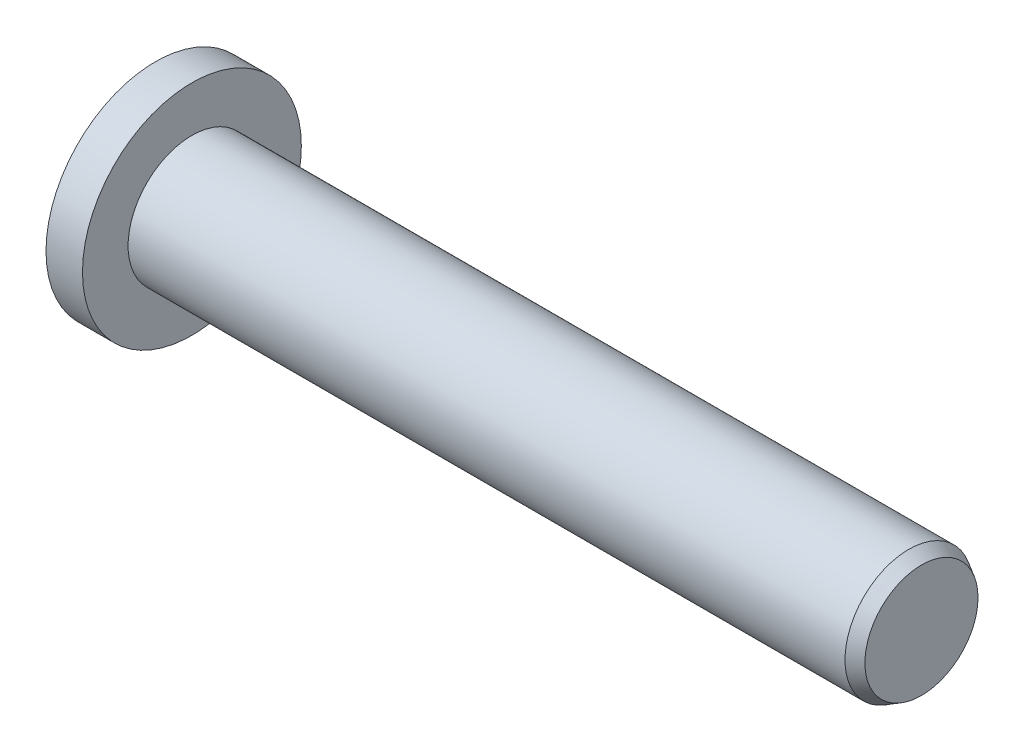
ISO-10303-21;
HEADER;
FILE_DESCRIPTION(('STEP AP214'),'2;1');
FILE_NAME('part.step','',(''),(''),'','','');
FILE_SCHEMA(('AUTOMOTIVE_DESIGN { 1 0 10303 214 1 1 1 1 }'));
ENDSEC;
DATA;
#1=APPLICATION_CONTEXT('core data for automotive mechanical design processes');
#2=APPLICATION_PROTOCOL_DEFINITION('international standard','automotive_design',2000,#1);
#3=PRODUCT_CONTEXT('',#1,'mechanical');
#4=PRODUCT('Part','Part','',(#3));
#5=PRODUCT_RELATED_PRODUCT_CATEGORY('part','',(#4));
#6=PRODUCT_DEFINITION_FORMATION('','',#4);
#7=PRODUCT_DEFINITION_CONTEXT('part definition',#1,'design');
#8=PRODUCT_DEFINITION('design','',#6,#7);
#9=PRODUCT_DEFINITION_SHAPE('','',#8);
#10=(LENGTH_UNIT() NAMED_UNIT(*) SI_UNIT(.MILLI.,.METRE.));
#11=(NAMED_UNIT(*) PLANE_ANGLE_UNIT() SI_UNIT($,.RADIAN.));
#12=(NAMED_UNIT(*) SI_UNIT($,.STERADIAN.) SOLID_ANGLE_UNIT());
#13=UNCERTAINTY_MEASURE_WITH_UNIT(LENGTH_MEASURE(1.E-05),#10,'distance_accuracy_value','');
#14=(GEOMETRIC_REPRESENTATION_CONTEXT(3) GLOBAL_UNCERTAINTY_ASSIGNED_CONTEXT((#13)) GLOBAL_UNIT_ASSIGNED_CONTEXT((#10,
#11,#12)) REPRESENTATION_CONTEXT('',''));
#15=CARTESIAN_POINT('',(0.,0.,0.));
#16=DIRECTION('',(0.,0.,1.));
#17=DIRECTION('',(1.,0.,0.));
#18=AXIS2_PLACEMENT_3D('',#15,#16,#17);
#19=CARTESIAN_POINT('',(0.,0.,0.));
#20=DIRECTION('',(-1.,0.,0.));
#21=DIRECTION('',(0.,0.,1.));
#22=AXIS2_PLACEMENT_3D('',#19,#20,#21);
#23=PLANE('',#22);
#24=CARTESIAN_POINT('',(0.,0.,0.));
#25=DIRECTION('',(1.,0.,0.));
#26=DIRECTION('',(0.,0.,-1.));
#27=AXIS2_PLACEMENT_3D('',#24,#25,#26);
#28=CIRCLE('',#27,3.);
#29=CARTESIAN_POINT('',(0.,0.,-3.));
#30=VERTEX_POINT('',#29);
#31=EDGE_CURVE('E10',#30,#30,#28,.T.);
#32=ORIENTED_EDGE('',*,*,#31,.F.);
#33=EDGE_LOOP('',(#32));
#34=FACE_BOUND('',#33,.T.);
#35=ADVANCED_FACE('F33',(#34),#23,.T.);
#36=CARTESIAN_POINT('',(0.,0.,0.));
#37=DIRECTION('',(1.,0.,0.));
#38=DIRECTION('',(0.,0.,-1.));
#39=AXIS2_PLACEMENT_3D('',#36,#37,#38);
#40=CYLINDRICAL_SURFACE('',#39,3.);
#41=ORIENTED_EDGE('',*,*,#31,.T.);
#42=EDGE_LOOP('',(#41));
#43=FACE_BOUND('',#42,.T.);
#44=CARTESIAN_POINT('',(1.,0.,0.));
#45=DIRECTION('',(1.,0.,0.));
#46=DIRECTION('',(0.,0.,-1.));
#47=AXIS2_PLACEMENT_3D('',#44,#45,#46);
#48=CIRCLE('',#47,3.);
#49=CARTESIAN_POINT('',(1.,0.,-3.));
#50=VERTEX_POINT('',#49);
#51=EDGE_CURVE('E39',#50,#50,#48,.T.);
#52=ORIENTED_EDGE('',*,*,#51,.F.);
#53=EDGE_LOOP('',(#52));
#54=FACE_BOUND('',#53,.T.);
#55=ADVANCED_FACE('F72',(#43,#54),#40,.T.);
#56=CARTESIAN_POINT('',(1.,3.,0.));
#57=DIRECTION('',(1.,0.,0.));
#58=DIRECTION('',(0.,0.,-1.));
#59=AXIS2_PLACEMENT_3D('',#56,#57,#58);
#60=PLANE('',#59);
#61=ORIENTED_EDGE('',*,*,#51,.T.);
#62=EDGE_LOOP('',(#61));
#63=FACE_BOUND('',#62,.T.);
#64=CARTESIAN_POINT('',(1.,0.,0.));
#65=DIRECTION('',(1.,0.,0.));
#66=DIRECTION('',(0.,0.,-1.));
#67=AXIS2_PLACEMENT_3D('',#64,#65,#66);
#68=CIRCLE('',#67,1.75);
#69=CARTESIAN_POINT('',(1.,0.,-1.75));
#70=VERTEX_POINT('',#69);
#71=EDGE_CURVE('E43',#70,#70,#68,.T.);
#72=ORIENTED_EDGE('',*,*,#71,.F.);
#73=EDGE_LOOP('',(#72));
#74=FACE_BOUND('',#73,.T.);
#75=ADVANCED_FACE('F68',(#63,#74),#60,.T.);
#76=CARTESIAN_POINT('',(0.,0.,0.));
#77=DIRECTION('',(1.,0.,0.));
#78=DIRECTION('',(0.,0.,-1.));
#79=AXIS2_PLACEMENT_3D('',#76,#77,#78);
#80=CYLINDRICAL_SURFACE('',#79,1.75);
#81=ORIENTED_EDGE('',*,*,#71,.T.);
#82=EDGE_LOOP('',(#81));
#83=FACE_BOUND('',#82,.T.);
#84=CARTESIAN_POINT('',(20.6535898384862,0.,0.));
#85=DIRECTION('',(1.,0.,0.));
#86=DIRECTION('',(0.,0.,-1.));
#87=AXIS2_PLACEMENT_3D('',#84,#85,#86);
#88=CIRCLE('',#87,1.75);
#89=CARTESIAN_POINT('',(20.6535898384862,0.,-1.75));
#90=VERTEX_POINT('',#89);
#91=EDGE_CURVE('E47',#90,#90,#88,.T.);
#92=ORIENTED_EDGE('',*,*,#91,.F.);
#93=EDGE_LOOP('',(#92));
#94=FACE_BOUND('',#93,.T.);
#95=ADVANCED_FACE('F60',(#83,#94),#80,.T.);
#96=CARTESIAN_POINT('',(21.,0.,0.));
#97=DIRECTION('',(-1.,0.,0.));
#98=DIRECTION('',(0.,0.,1.));
#99=AXIS2_PLACEMENT_3D('',#96,#97,#98);
#100=CONICAL_SURFACE('',#99,1.55,0.523598775598298);
#101=ORIENTED_EDGE('',*,*,#91,.T.);
#102=EDGE_LOOP('',(#101));
#103=FACE_BOUND('',#102,.T.);
#104=CARTESIAN_POINT('',(21.,0.,0.));
#105=DIRECTION('',(1.,0.,0.));
#106=DIRECTION('',(0.,0.,-1.));
#107=AXIS2_PLACEMENT_3D('',#104,#105,#106);
#108=CIRCLE('',#107,1.55);
#109=CARTESIAN_POINT('',(21.,0.,-1.55));
#110=VERTEX_POINT('',#109);
#111=EDGE_CURVE('E52',#110,#110,#108,.T.);
#112=ORIENTED_EDGE('',*,*,#111,.F.);
#113=EDGE_LOOP('',(#112));
#114=FACE_BOUND('',#113,.T.);
#115=ADVANCED_FACE('F58',(#103,#114),#100,.T.);
#116=CARTESIAN_POINT('',(21.,1.55,0.));
#117=DIRECTION('',(1.,0.,0.));
#118=DIRECTION('',(0.,0.,-1.));
#119=AXIS2_PLACEMENT_3D('',#116,#117,#118);
#120=PLANE('',#119);
#121=ORIENTED_EDGE('',*,*,#111,.T.);
#122=EDGE_LOOP('',(#121));
#123=FACE_BOUND('',#122,.T.);
#124=ADVANCED_FACE('F56',(#123),#120,.T.);
#125=CLOSED_SHELL('',(#35,#55,#75,#95,#115,#124));
#126=MANIFOLD_SOLID_BREP('B2',#125);
#127=ADVANCED_BREP_SHAPE_REPRESENTATION('',(#18,#126),#14);
#128=SHAPE_DEFINITION_REPRESENTATION(#9,#127);
ENDSEC;
END-ISO-10303-21;
